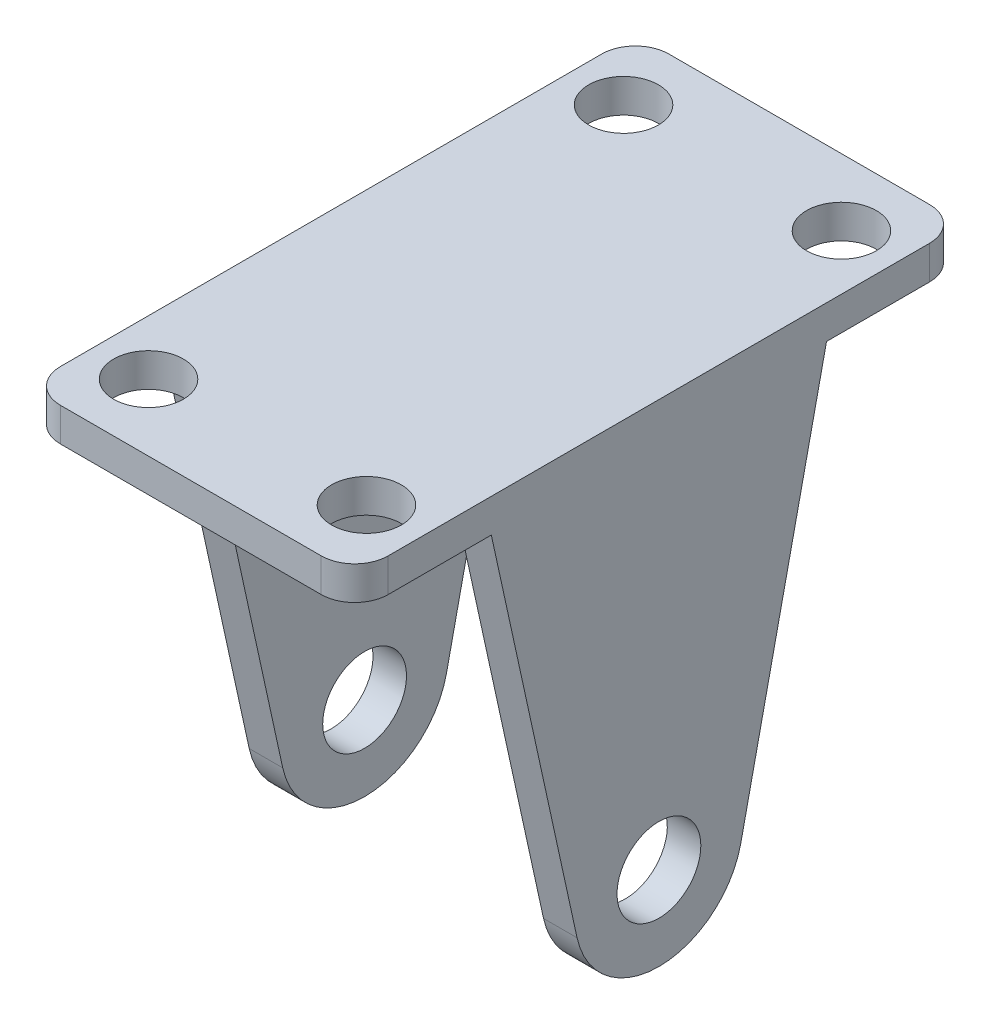
ISO-10303-21;
HEADER;
FILE_DESCRIPTION(('STEP AP214'),'2;1');
FILE_NAME('part.step','',(''),(''),'','','');
FILE_SCHEMA(('AUTOMOTIVE_DESIGN { 1 0 10303 214 1 1 1 1 }'));
ENDSEC;
DATA;
#1=APPLICATION_CONTEXT('core data for automotive mechanical design processes');
#2=APPLICATION_PROTOCOL_DEFINITION('international standard','automotive_design',2000,#1);
#3=PRODUCT_CONTEXT('',#1,'mechanical');
#4=PRODUCT('Part','Part','',(#3));
#5=PRODUCT_RELATED_PRODUCT_CATEGORY('part','',(#4));
#6=PRODUCT_DEFINITION_FORMATION('','',#4);
#7=PRODUCT_DEFINITION_CONTEXT('part definition',#1,'design');
#8=PRODUCT_DEFINITION('design','',#6,#7);
#9=PRODUCT_DEFINITION_SHAPE('','',#8);
#10=(LENGTH_UNIT() NAMED_UNIT(*) SI_UNIT(.MILLI.,.METRE.));
#11=(NAMED_UNIT(*) PLANE_ANGLE_UNIT() SI_UNIT($,.RADIAN.));
#12=(NAMED_UNIT(*) SI_UNIT($,.STERADIAN.) SOLID_ANGLE_UNIT());
#13=UNCERTAINTY_MEASURE_WITH_UNIT(LENGTH_MEASURE(1.E-05),#10,'distance_accuracy_value','');
#14=(GEOMETRIC_REPRESENTATION_CONTEXT(3) GLOBAL_UNCERTAINTY_ASSIGNED_CONTEXT((#13)) GLOBAL_UNIT_ASSIGNED_CONTEXT((#10,
#11,#12)) REPRESENTATION_CONTEXT('',''));
#15=CARTESIAN_POINT('',(0.,0.,0.));
#16=DIRECTION('',(0.,0.,1.));
#17=DIRECTION('',(1.,0.,0.));
#18=AXIS2_PLACEMENT_3D('',#15,#16,#17);
#19=CARTESIAN_POINT('',(55.4001095481556,-32.2188982579742,6.20311311528255));
#20=DIRECTION('',(0.,0.213842245350275,-0.976868207131112));
#21=DIRECTION('',(0.,0.976868207131112,0.213842245350275));
#22=AXIS2_PLACEMENT_3D('',#19,#20,#21);
#23=PLANE('',#22);
#24=DIRECTION('',(-1.,0.,0.));
#25=VECTOR('',#24,1.);
#26=CARTESIAN_POINT('',(55.4001095481556,-32.2188982579742,6.20311311528255));
#27=LINE('',#26,#25);
#28=CARTESIAN_POINT('',(-9.8806,-32.2188982579742,6.20311311528254));
#29=VERTEX_POINT('',#28);
#30=CARTESIAN_POINT('',(-12.4206,-32.2188982579742,6.20311311528255));
#31=VERTEX_POINT('',#30);
#32=EDGE_CURVE('E192',#29,#31,#27,.T.);
#33=ORIENTED_EDGE('',*,*,#32,.F.);
#34=DIRECTION('',(0.,0.976868207131112,0.213842245350275));
#35=VECTOR('',#34,1.);
#36=CARTESIAN_POINT('',(-9.8806,-32.2188982579742,6.20311311528255));
#37=LINE('',#36,#35);
#38=CARTESIAN_POINT('',(-9.8806,-5.08,12.1439789326496));
#39=VERTEX_POINT('',#38);
#40=EDGE_CURVE('E395',#29,#39,#37,.T.);
#41=ORIENTED_EDGE('',*,*,#40,.T.);
#42=CARTESIAN_POINT('',(-7.34059999999999,-5.08,12.1439789326496));
#43=DIRECTION('',(0.,0.213842245350275,-0.976868207131112));
#44=DIRECTION('',(0.,-0.976868207131112,-0.213842245350275));
#45=AXIS2_PLACEMENT_3D('',#42,#43,#44);
#46=ELLIPSE('',#45,2.60014603961729,2.54);
#47=CARTESIAN_POINT('',(-7.34059999999999,-2.54,12.7));
#48=VERTEX_POINT('',#47);
#49=EDGE_CURVE('E353',#39,#48,#46,.T.);
#50=ORIENTED_EDGE('',*,*,#49,.T.);
#51=DIRECTION('',(-1.,0.,0.));
#52=VECTOR('',#51,1.);
#53=CARTESIAN_POINT('',(55.4001095481556,-2.54,12.7));
#54=LINE('',#53,#52);
#55=CARTESIAN_POINT('',(-12.4206,-2.54,12.7));
#56=VERTEX_POINT('',#55);
#57=EDGE_CURVE('E191',#48,#56,#54,.T.);
#58=ORIENTED_EDGE('',*,*,#57,.T.);
#59=DIRECTION('',(0.,-0.976868207131112,-0.213842245350275));
#60=VECTOR('',#59,1.);
#61=CARTESIAN_POINT('',(-12.4206,-32.2188982579742,6.20311311528255));
#62=LINE('',#61,#60);
#63=EDGE_CURVE('E383',#56,#31,#62,.T.);
#64=ORIENTED_EDGE('',*,*,#63,.T.);
#65=EDGE_LOOP('',(#33,#41,#50,#58,#64));
#66=FACE_BOUND('',#65,.T.);
#67=ADVANCED_FACE('F44',(#66),#23,.F.);
#68=CARTESIAN_POINT('',(55.4001095481556,-2.54,-12.7));
#69=DIRECTION('',(0.,0.213842245350274,0.976868207131112));
#70=DIRECTION('',(0.,-0.976868207131112,0.213842245350274));
#71=AXIS2_PLACEMENT_3D('',#68,#69,#70);
#72=PLANE('',#71);
#73=DIRECTION('',(-1.,0.,0.));
#74=VECTOR('',#73,1.);
#75=CARTESIAN_POINT('',(55.4001095481556,-2.54,-12.7));
#76=LINE('',#75,#74);
#77=CARTESIAN_POINT('',(-7.3406,-2.54,-12.7));
#78=VERTEX_POINT('',#77);
#79=CARTESIAN_POINT('',(-12.4206,-2.54,-12.7));
#80=VERTEX_POINT('',#79);
#81=EDGE_CURVE('E202',#78,#80,#76,.T.);
#82=ORIENTED_EDGE('',*,*,#81,.F.);
#83=CARTESIAN_POINT('',(-7.34059999999999,-5.08,-12.1439789326496));
#84=DIRECTION('',(0.,0.213842245350274,0.976868207131112));
#85=DIRECTION('',(0.,0.976868207131112,-0.213842245350274));
#86=AXIS2_PLACEMENT_3D('',#83,#84,#85);
#87=ELLIPSE('',#86,2.60014603961729,2.54);
#88=CARTESIAN_POINT('',(-9.8806,-5.08,-12.1439789326496));
#89=VERTEX_POINT('',#88);
#90=EDGE_CURVE('E357',#78,#89,#87,.T.);
#91=ORIENTED_EDGE('',*,*,#90,.T.);
#92=DIRECTION('',(0.,-0.976868207131112,0.213842245350274));
#93=VECTOR('',#92,1.);
#94=CARTESIAN_POINT('',(-9.8806,-2.54,-12.7));
#95=LINE('',#94,#93);
#96=CARTESIAN_POINT('',(-9.8806,-32.2188982579742,-6.20311311528256));
#97=VERTEX_POINT('',#96);
#98=EDGE_CURVE('E419',#89,#97,#95,.T.);
#99=ORIENTED_EDGE('',*,*,#98,.T.);
#100=DIRECTION('',(-1.,0.,0.));
#101=VECTOR('',#100,1.);
#102=CARTESIAN_POINT('',(55.4001095481556,-32.2188982579742,-6.20311311528256));
#103=LINE('',#102,#101);
#104=CARTESIAN_POINT('',(-12.4206,-32.2188982579742,-6.20311311528256));
#105=VERTEX_POINT('',#104);
#106=EDGE_CURVE('E206',#97,#105,#103,.T.);
#107=ORIENTED_EDGE('',*,*,#106,.T.);
#108=DIRECTION('',(0.,0.976868207131112,-0.213842245350274));
#109=VECTOR('',#108,1.);
#110=CARTESIAN_POINT('',(-12.4206,-2.54,-12.7));
#111=LINE('',#110,#109);
#112=EDGE_CURVE('E376',#105,#80,#111,.T.);
#113=ORIENTED_EDGE('',*,*,#112,.T.);
#114=EDGE_LOOP('',(#82,#91,#99,#107,#113));
#115=FACE_BOUND('',#114,.T.);
#116=ADVANCED_FACE('F377',(#115),#72,.F.);
#117=CARTESIAN_POINT('',(55.4001095481556,-30.861,0.));
#118=DIRECTION('',(-1.,0.,0.));
#119=DIRECTION('',(0.,0.,1.));
#120=AXIS2_PLACEMENT_3D('',#117,#118,#119);
#121=CYLINDRICAL_SURFACE('',#120,6.34999999999999);
#122=CARTESIAN_POINT('',(9.8806,-30.861,0.));
#123=DIRECTION('',(1.,0.,0.));
#124=DIRECTION('',(0.,1.,0.));
#125=AXIS2_PLACEMENT_3D('',#122,#123,#124);
#126=CIRCLE('',#125,6.34999999999999);
#127=CARTESIAN_POINT('',(9.8806,-32.2188982579742,6.20311311528254));
#128=VERTEX_POINT('',#127);
#129=CARTESIAN_POINT('',(9.8806,-32.2188982579742,-6.20311311528256));
#130=VERTEX_POINT('',#129);
#131=EDGE_CURVE('E178',#128,#130,#126,.T.);
#132=ORIENTED_EDGE('',*,*,#131,.T.);
#133=CARTESIAN_POINT('',(12.4206,-32.2188982579742,-6.20311311528256));
#134=VERTEX_POINT('',#133);
#135=EDGE_CURVE('E207',#134,#130,#103,.T.);
#136=ORIENTED_EDGE('',*,*,#135,.F.);
#137=CARTESIAN_POINT('',(12.4206,-30.861,0.));
#138=DIRECTION('',(1.,0.,0.));
#139=DIRECTION('',(0.,0.,-1.));
#140=AXIS2_PLACEMENT_3D('',#137,#138,#139);
#141=CIRCLE('',#140,6.34999999999999);
#142=CARTESIAN_POINT('',(12.4206,-32.2188982579742,6.20311311528255));
#143=VERTEX_POINT('',#142);
#144=EDGE_CURVE('E188',#143,#134,#141,.T.);
#145=ORIENTED_EDGE('',*,*,#144,.F.);
#146=EDGE_CURVE('E172',#143,#128,#27,.T.);
#147=ORIENTED_EDGE('',*,*,#146,.T.);
#148=EDGE_LOOP('',(#132,#136,#145,#147));
#149=FACE_BOUND('',#148,.T.);
#150=ADVANCED_FACE('F186',(#149),#121,.T.);
#151=CARTESIAN_POINT('',(55.4001095481556,-30.861,0.));
#152=DIRECTION('',(-1.,0.,0.));
#153=DIRECTION('',(0.,0.,1.));
#154=AXIS2_PLACEMENT_3D('',#151,#152,#153);
#155=CYLINDRICAL_SURFACE('',#154,3.175);
#156=CARTESIAN_POINT('',(-9.8806,-30.861,0.));
#157=DIRECTION('',(-1.,0.,0.));
#158=DIRECTION('',(0.,-1.,0.));
#159=AXIS2_PLACEMENT_3D('',#156,#157,#158);
#160=CIRCLE('',#159,3.175);
#161=CARTESIAN_POINT('',(-9.8806,-34.036,0.));
#162=VERTEX_POINT('',#161);
#163=EDGE_CURVE('E175',#162,#162,#160,.T.);
#164=ORIENTED_EDGE('',*,*,#163,.F.);
#165=EDGE_LOOP('',(#164));
#166=FACE_BOUND('',#165,.T.);
#167=CARTESIAN_POINT('',(-12.4206,-30.861,0.));
#168=DIRECTION('',(-1.,0.,0.));
#169=DIRECTION('',(0.,0.,1.));
#170=AXIS2_PLACEMENT_3D('',#167,#168,#169);
#171=CIRCLE('',#170,3.175);
#172=CARTESIAN_POINT('',(-12.4206,-30.861,3.17499999999999));
#173=VERTEX_POINT('',#172);
#174=EDGE_CURVE('E216',#173,#173,#171,.F.);
#175=ORIENTED_EDGE('',*,*,#174,.F.);
#176=EDGE_LOOP('',(#175));
#177=FACE_BOUND('',#176,.T.);
#178=ADVANCED_FACE('F524',(#166,#177),#155,.F.);
#179=CARTESIAN_POINT('',(-12.4206,-2.54,23.0505));
#180=DIRECTION('',(-1.,0.,0.));
#181=DIRECTION('',(0.,0.,1.));
#182=AXIS2_PLACEMENT_3D('',#179,#180,#181);
#183=PLANE('',#182);
#184=DIRECTION('',(0.,0.,1.));
#185=VECTOR('',#184,1.);
#186=CARTESIAN_POINT('',(-12.4206,0.,23.0505));
#187=LINE('',#186,#185);
#188=CARTESIAN_POINT('',(-12.4206,0.,-20.5105));
#189=VERTEX_POINT('',#188);
#190=CARTESIAN_POINT('',(-12.4206,0.,20.5105));
#191=VERTEX_POINT('',#190);
#192=EDGE_CURVE('E245',#189,#191,#187,.T.);
#193=ORIENTED_EDGE('',*,*,#192,.F.);
#194=DIRECTION('',(0.,1.,0.));
#195=VECTOR('',#194,1.);
#196=CARTESIAN_POINT('',(-12.4206,-2.54,-20.5105));
#197=LINE('',#196,#195);
#198=CARTESIAN_POINT('',(-12.4206,-2.54,-20.5105));
#199=VERTEX_POINT('',#198);
#200=EDGE_CURVE('E310',#189,#199,#197,.F.);
#201=ORIENTED_EDGE('',*,*,#200,.T.);
#202=DIRECTION('',(0.,0.,1.));
#203=VECTOR('',#202,1.);
#204=CARTESIAN_POINT('',(-12.4206,-2.54,23.0505));
#205=LINE('',#204,#203);
#206=EDGE_CURVE('E249',#199,#80,#205,.T.);
#207=ORIENTED_EDGE('',*,*,#206,.T.);
#208=ORIENTED_EDGE('',*,*,#112,.F.);
#209=CARTESIAN_POINT('',(-12.4206,-30.861,0.));
#210=DIRECTION('',(-1.,0.,0.));
#211=DIRECTION('',(0.,0.,1.));
#212=AXIS2_PLACEMENT_3D('',#209,#210,#211);
#213=CIRCLE('',#212,6.34999999999999);
#214=EDGE_CURVE('E390',#31,#105,#213,.F.);
#215=ORIENTED_EDGE('',*,*,#214,.F.);
#216=ORIENTED_EDGE('',*,*,#63,.F.);
#217=CARTESIAN_POINT('',(-12.4206,-2.54,20.5105));
#218=VERTEX_POINT('',#217);
#219=EDGE_CURVE('E253',#56,#218,#205,.T.);
#220=ORIENTED_EDGE('',*,*,#219,.T.);
#221=DIRECTION('',(0.,1.,0.));
#222=VECTOR('',#221,1.);
#223=CARTESIAN_POINT('',(-12.4206,-2.54,20.5105));
#224=LINE('',#223,#222);
#225=EDGE_CURVE('E306',#218,#191,#224,.T.);
#226=ORIENTED_EDGE('',*,*,#225,.T.);
#227=EDGE_LOOP('',(#193,#201,#207,#208,#215,#216,#220,#226));
#228=FACE_BOUND('',#227,.T.);
#229=ORIENTED_EDGE('',*,*,#174,.T.);
#230=EDGE_LOOP('',(#229));
#231=FACE_BOUND('',#230,.T.);
#232=ADVANCED_FACE('F434',(#228,#231),#183,.T.);
#233=CARTESIAN_POINT('',(12.4206,-2.54,-23.0505));
#234=DIRECTION('',(0.,0.,-1.));
#235=DIRECTION('',(-1.,0.,0.));
#236=AXIS2_PLACEMENT_3D('',#233,#234,#235);
#237=PLANE('',#236);
#238=DIRECTION('',(-1.,0.,0.));
#239=VECTOR('',#238,1.);
#240=CARTESIAN_POINT('',(12.4206,-2.54,-23.0505));
#241=LINE('',#240,#239);
#242=CARTESIAN_POINT('',(9.8806,-2.54,-23.0505));
#243=VERTEX_POINT('',#242);
#244=CARTESIAN_POINT('',(-9.8806,-2.54,-23.0505));
#245=VERTEX_POINT('',#244);
#246=EDGE_CURVE('E261',#243,#245,#241,.T.);
#247=ORIENTED_EDGE('',*,*,#246,.T.);
#248=DIRECTION('',(0.,1.,0.));
#249=VECTOR('',#248,1.);
#250=CARTESIAN_POINT('',(-9.8806,-2.54,-23.0505));
#251=LINE('',#250,#249);
#252=CARTESIAN_POINT('',(-9.8806,0.,-23.0505));
#253=VERTEX_POINT('',#252);
#254=EDGE_CURVE('E290',#245,#253,#251,.T.);
#255=ORIENTED_EDGE('',*,*,#254,.T.);
#256=DIRECTION('',(-1.,0.,0.));
#257=VECTOR('',#256,1.);
#258=CARTESIAN_POINT('',(12.4206,0.,-23.0505));
#259=LINE('',#258,#257);
#260=CARTESIAN_POINT('',(9.8806,0.,-23.0505));
#261=VERTEX_POINT('',#260);
#262=EDGE_CURVE('E277',#261,#253,#259,.T.);
#263=ORIENTED_EDGE('',*,*,#262,.F.);
#264=DIRECTION('',(0.,1.,0.));
#265=VECTOR('',#264,1.);
#266=CARTESIAN_POINT('',(9.8806,-2.54,-23.0505));
#267=LINE('',#266,#265);
#268=EDGE_CURVE('E265',#261,#243,#267,.F.);
#269=ORIENTED_EDGE('',*,*,#268,.T.);
#270=EDGE_LOOP('',(#247,#255,#263,#269));
#271=FACE_BOUND('',#270,.T.);
#272=ADVANCED_FACE('F461',(#271),#237,.T.);
#273=CARTESIAN_POINT('',(12.4206,-2.54,23.0505));
#274=DIRECTION('',(1.,0.,0.));
#275=DIRECTION('',(0.,0.,-1.));
#276=AXIS2_PLACEMENT_3D('',#273,#274,#275);
#277=PLANE('',#276);
#278=DIRECTION('',(0.,0.,-1.));
#279=VECTOR('',#278,1.);
#280=CARTESIAN_POINT('',(12.4206,-2.54,23.0505));
#281=LINE('',#280,#279);
#282=CARTESIAN_POINT('',(12.4206,-2.54,-12.7));
#283=VERTEX_POINT('',#282);
#284=CARTESIAN_POINT('',(12.4206,-2.54,-20.5105));
#285=VERTEX_POINT('',#284);
#286=EDGE_CURVE('E257',#283,#285,#281,.T.);
#287=ORIENTED_EDGE('',*,*,#286,.T.);
#288=DIRECTION('',(0.,1.,0.));
#289=VECTOR('',#288,1.);
#290=CARTESIAN_POINT('',(12.4206,-2.54,-20.5105));
#291=LINE('',#290,#289);
#292=CARTESIAN_POINT('',(12.4206,0.,-20.5105));
#293=VERTEX_POINT('',#292);
#294=EDGE_CURVE('E336',#285,#293,#291,.T.);
#295=ORIENTED_EDGE('',*,*,#294,.T.);
#296=DIRECTION('',(0.,0.,-1.));
#297=VECTOR('',#296,1.);
#298=CARTESIAN_POINT('',(12.4206,0.,23.0505));
#299=LINE('',#298,#297);
#300=CARTESIAN_POINT('',(12.4206,0.,20.5105));
#301=VERTEX_POINT('',#300);
#302=EDGE_CURVE('E273',#301,#293,#299,.T.);
#303=ORIENTED_EDGE('',*,*,#302,.F.);
#304=DIRECTION('',(0.,1.,0.));
#305=VECTOR('',#304,1.);
#306=CARTESIAN_POINT('',(12.4206,-2.54,20.5105));
#307=LINE('',#306,#305);
#308=CARTESIAN_POINT('',(12.4206,-2.54,20.5105));
#309=VERTEX_POINT('',#308);
#310=EDGE_CURVE('E333',#301,#309,#307,.F.);
#311=ORIENTED_EDGE('',*,*,#310,.T.);
#312=CARTESIAN_POINT('',(12.4206,-2.54,12.7));
#313=VERTEX_POINT('',#312);
#314=EDGE_CURVE('E258',#309,#313,#281,.T.);
#315=ORIENTED_EDGE('',*,*,#314,.T.);
#316=DIRECTION('',(0.,-0.976868207131112,-0.213842245350275));
#317=VECTOR('',#316,1.);
#318=CARTESIAN_POINT('',(12.4206,-32.2188982579742,6.20311311528255));
#319=LINE('',#318,#317);
#320=EDGE_CURVE('E215',#313,#143,#319,.T.);
#321=ORIENTED_EDGE('',*,*,#320,.T.);
#322=ORIENTED_EDGE('',*,*,#144,.T.);
#323=DIRECTION('',(0.,0.976868207131112,-0.213842245350274));
#324=VECTOR('',#323,1.);
#325=CARTESIAN_POINT('',(12.4206,-2.54,-12.7));
#326=LINE('',#325,#324);
#327=EDGE_CURVE('E398',#134,#283,#326,.T.);
#328=ORIENTED_EDGE('',*,*,#327,.T.);
#329=EDGE_LOOP('',(#287,#295,#303,#311,#315,#321,#322,#328));
#330=FACE_BOUND('',#329,.T.);
#331=CARTESIAN_POINT('',(12.4206,-30.861,0.));
#332=DIRECTION('',(1.,0.,0.));
#333=DIRECTION('',(0.,0.,-1.));
#334=AXIS2_PLACEMENT_3D('',#331,#332,#333);
#335=CIRCLE('',#334,3.175);
#336=CARTESIAN_POINT('',(12.4206,-30.861,-3.17500000000001));
#337=VERTEX_POINT('',#336);
#338=EDGE_CURVE('E211',#337,#337,#335,.T.);
#339=ORIENTED_EDGE('',*,*,#338,.F.);
#340=EDGE_LOOP('',(#339));
#341=FACE_BOUND('',#340,.T.);
#342=ADVANCED_FACE('F403',(#330,#341),#277,.T.);
#343=CARTESIAN_POINT('',(12.4206,-2.54,23.0505));
#344=DIRECTION('',(0.,0.,1.));
#345=DIRECTION('',(1.,0.,0.));
#346=AXIS2_PLACEMENT_3D('',#343,#344,#345);
#347=PLANE('',#346);
#348=DIRECTION('',(1.,0.,0.));
#349=VECTOR('',#348,1.);
#350=CARTESIAN_POINT('',(12.4206,0.,23.0505));
#351=LINE('',#350,#349);
#352=CARTESIAN_POINT('',(-9.8806,0.,23.0505));
#353=VERTEX_POINT('',#352);
#354=CARTESIAN_POINT('',(9.8806,0.,23.0505));
#355=VERTEX_POINT('',#354);
#356=EDGE_CURVE('E269',#353,#355,#351,.T.);
#357=ORIENTED_EDGE('',*,*,#356,.F.);
#358=DIRECTION('',(0.,1.,0.));
#359=VECTOR('',#358,1.);
#360=CARTESIAN_POINT('',(-9.8806,-2.54,23.0505));
#361=LINE('',#360,#359);
#362=CARTESIAN_POINT('',(-9.8806,-2.54,23.0505));
#363=VERTEX_POINT('',#362);
#364=EDGE_CURVE('E344',#353,#363,#361,.F.);
#365=ORIENTED_EDGE('',*,*,#364,.T.);
#366=DIRECTION('',(1.,0.,0.));
#367=VECTOR('',#366,1.);
#368=CARTESIAN_POINT('',(12.4206,-2.54,23.0505));
#369=LINE('',#368,#367);
#370=CARTESIAN_POINT('',(9.8806,-2.54,23.0505));
#371=VERTEX_POINT('',#370);
#372=EDGE_CURVE('E252',#363,#371,#369,.T.);
#373=ORIENTED_EDGE('',*,*,#372,.T.);
#374=DIRECTION('',(0.,1.,0.));
#375=VECTOR('',#374,1.);
#376=CARTESIAN_POINT('',(9.8806,-2.54,23.0505));
#377=LINE('',#376,#375);
#378=EDGE_CURVE('E340',#371,#355,#377,.T.);
#379=ORIENTED_EDGE('',*,*,#378,.T.);
#380=EDGE_LOOP('',(#357,#365,#373,#379));
#381=FACE_BOUND('',#380,.T.);
#382=ADVANCED_FACE('F447',(#381),#347,.T.);
#383=CARTESIAN_POINT('',(0.,-2.54,0.));
#384=DIRECTION('',(0.,1.,0.));
#385=DIRECTION('',(0.,0.,1.));
#386=AXIS2_PLACEMENT_3D('',#383,#384,#385);
#387=PLANE('',#386);
#388=CARTESIAN_POINT('',(-8.25499999999999,-2.54,17.9959));
#389=DIRECTION('',(0.,1.,0.));
#390=DIRECTION('',(0.,0.,1.));
#391=AXIS2_PLACEMENT_3D('',#388,#389,#390);
#392=CIRCLE('',#391,2.6416);
#393=CARTESIAN_POINT('',(-8.25499999999999,-2.54,20.6375));
#394=VERTEX_POINT('',#393);
#395=EDGE_CURVE('E217',#394,#394,#392,.T.);
#396=ORIENTED_EDGE('',*,*,#395,.T.);
#397=EDGE_LOOP('',(#396));
#398=FACE_BOUND('',#397,.T.);
#399=CARTESIAN_POINT('',(8.25500000000001,-2.54,17.9959));
#400=DIRECTION('',(0.,1.,0.));
#401=DIRECTION('',(0.,0.,1.));
#402=AXIS2_PLACEMENT_3D('',#399,#400,#401);
#403=CIRCLE('',#402,2.6416);
#404=CARTESIAN_POINT('',(8.25500000000001,-2.54,20.6375));
#405=VERTEX_POINT('',#404);
#406=EDGE_CURVE('E225',#405,#405,#403,.T.);
#407=ORIENTED_EDGE('',*,*,#406,.T.);
#408=EDGE_LOOP('',(#407));
#409=FACE_BOUND('',#408,.T.);
#410=CARTESIAN_POINT('',(-8.255,-2.54,-17.9959));
#411=DIRECTION('',(0.,1.,0.));
#412=DIRECTION('',(0.,0.,1.));
#413=AXIS2_PLACEMENT_3D('',#410,#411,#412);
#414=CIRCLE('',#413,2.6416);
#415=CARTESIAN_POINT('',(-8.255,-2.54,-15.3543));
#416=VERTEX_POINT('',#415);
#417=EDGE_CURVE('E241',#416,#416,#414,.T.);
#418=ORIENTED_EDGE('',*,*,#417,.T.);
#419=EDGE_LOOP('',(#418));
#420=FACE_BOUND('',#419,.T.);
#421=CARTESIAN_POINT('',(8.25500000000001,-2.54,-17.9959));
#422=DIRECTION('',(0.,1.,0.));
#423=DIRECTION('',(0.,0.,1.));
#424=AXIS2_PLACEMENT_3D('',#421,#422,#423);
#425=CIRCLE('',#424,2.6416);
#426=CARTESIAN_POINT('',(8.25500000000001,-2.54,-15.3543));
#427=VERTEX_POINT('',#426);
#428=EDGE_CURVE('E233',#427,#427,#425,.T.);
#429=ORIENTED_EDGE('',*,*,#428,.T.);
#430=EDGE_LOOP('',(#429));
#431=FACE_BOUND('',#430,.T.);
#432=ORIENTED_EDGE('',*,*,#206,.F.);
#433=CARTESIAN_POINT('',(-9.8806,-2.54,-20.5105));
#434=DIRECTION('',(0.,1.,0.));
#435=DIRECTION('',(0.,0.,1.));
#436=AXIS2_PLACEMENT_3D('',#433,#434,#435);
#437=CIRCLE('',#436,2.54);
#438=EDGE_CURVE('E330',#199,#245,#437,.F.);
#439=ORIENTED_EDGE('',*,*,#438,.T.);
#440=ORIENTED_EDGE('',*,*,#246,.F.);
#441=CARTESIAN_POINT('',(9.8806,-2.54,-20.5105));
#442=DIRECTION('',(0.,1.,0.));
#443=DIRECTION('',(0.,0.,1.));
#444=AXIS2_PLACEMENT_3D('',#441,#442,#443);
#445=CIRCLE('',#444,2.54);
#446=EDGE_CURVE('E327',#243,#285,#445,.F.);
#447=ORIENTED_EDGE('',*,*,#446,.T.);
#448=ORIENTED_EDGE('',*,*,#286,.F.);
#449=CARTESIAN_POINT('',(7.3406,-2.54,-12.7));
#450=VERTEX_POINT('',#449);
#451=EDGE_CURVE('E203',#283,#450,#76,.T.);
#452=ORIENTED_EDGE('',*,*,#451,.T.);
#453=DIRECTION('',(0.,0.,1.));
#454=VECTOR('',#453,1.);
#455=CARTESIAN_POINT('',(7.3406,-2.54,12.7));
#456=LINE('',#455,#454);
#457=CARTESIAN_POINT('',(7.3406,-2.54,12.7));
#458=VERTEX_POINT('',#457);
#459=EDGE_CURVE('E313',#450,#458,#456,.T.);
#460=ORIENTED_EDGE('',*,*,#459,.T.);
#461=EDGE_CURVE('E196',#313,#458,#54,.T.);
#462=ORIENTED_EDGE('',*,*,#461,.F.);
#463=ORIENTED_EDGE('',*,*,#314,.F.);
#464=CARTESIAN_POINT('',(9.8806,-2.54,20.5105));
#465=DIRECTION('',(0.,1.,0.));
#466=DIRECTION('',(0.,0.,1.));
#467=AXIS2_PLACEMENT_3D('',#464,#465,#466);
#468=CIRCLE('',#467,2.54);
#469=EDGE_CURVE('E321',#309,#371,#468,.F.);
#470=ORIENTED_EDGE('',*,*,#469,.T.);
#471=ORIENTED_EDGE('',*,*,#372,.F.);
#472=CARTESIAN_POINT('',(-9.8806,-2.54,20.5105));
#473=DIRECTION('',(0.,1.,0.));
#474=DIRECTION('',(0.,0.,1.));
#475=AXIS2_PLACEMENT_3D('',#472,#473,#474);
#476=CIRCLE('',#475,2.54);
#477=EDGE_CURVE('E324',#363,#218,#476,.F.);
#478=ORIENTED_EDGE('',*,*,#477,.T.);
#479=ORIENTED_EDGE('',*,*,#219,.F.);
#480=ORIENTED_EDGE('',*,*,#57,.F.);
#481=DIRECTION('',(0.,0.,1.));
#482=VECTOR('',#481,1.);
#483=CARTESIAN_POINT('',(-7.34059999999999,-2.54,-12.7));
#484=LINE('',#483,#482);
#485=EDGE_CURVE('E317',#48,#78,#484,.F.);
#486=ORIENTED_EDGE('',*,*,#485,.T.);
#487=ORIENTED_EDGE('',*,*,#81,.T.);
#488=EDGE_LOOP('',(#432,#439,#440,#447,#448,#452,#460,#462,#463,#470,#471,#478,#479,#480,#486,#487));
#489=FACE_BOUND('',#488,.T.);
#490=ADVANCED_FACE('F370',(#398,#409,#420,#431,#489),#387,.F.);
#491=CARTESIAN_POINT('',(0.,0.,0.));
#492=DIRECTION('',(0.,1.,0.));
#493=DIRECTION('',(0.,0.,1.));
#494=AXIS2_PLACEMENT_3D('',#491,#492,#493);
#495=PLANE('',#494);
#496=CARTESIAN_POINT('',(-8.25499999999999,0.,17.9959));
#497=DIRECTION('',(0.,1.,0.));
#498=DIRECTION('',(0.,0.,1.));
#499=AXIS2_PLACEMENT_3D('',#496,#497,#498);
#500=CIRCLE('',#499,2.6416);
#501=CARTESIAN_POINT('',(-8.25499999999999,0.,20.6375));
#502=VERTEX_POINT('',#501);
#503=EDGE_CURVE('E210',#502,#502,#500,.T.);
#504=ORIENTED_EDGE('',*,*,#503,.F.);
#505=EDGE_LOOP('',(#504));
#506=FACE_BOUND('',#505,.T.);
#507=CARTESIAN_POINT('',(8.25500000000001,0.,17.9959));
#508=DIRECTION('',(0.,1.,0.));
#509=DIRECTION('',(0.,0.,1.));
#510=AXIS2_PLACEMENT_3D('',#507,#508,#509);
#511=CIRCLE('',#510,2.6416);
#512=CARTESIAN_POINT('',(8.25500000000001,0.,20.6375));
#513=VERTEX_POINT('',#512);
#514=EDGE_CURVE('E221',#513,#513,#511,.T.);
#515=ORIENTED_EDGE('',*,*,#514,.F.);
#516=EDGE_LOOP('',(#515));
#517=FACE_BOUND('',#516,.T.);
#518=CARTESIAN_POINT('',(8.25500000000001,0.,-17.9959));
#519=DIRECTION('',(0.,1.,0.));
#520=DIRECTION('',(0.,0.,1.));
#521=AXIS2_PLACEMENT_3D('',#518,#519,#520);
#522=CIRCLE('',#521,2.6416);
#523=CARTESIAN_POINT('',(8.25500000000001,0.,-15.3543));
#524=VERTEX_POINT('',#523);
#525=EDGE_CURVE('E229',#524,#524,#522,.T.);
#526=ORIENTED_EDGE('',*,*,#525,.F.);
#527=EDGE_LOOP('',(#526));
#528=FACE_BOUND('',#527,.T.);
#529=CARTESIAN_POINT('',(-8.255,0.,-17.9959));
#530=DIRECTION('',(0.,1.,0.));
#531=DIRECTION('',(0.,0.,1.));
#532=AXIS2_PLACEMENT_3D('',#529,#530,#531);
#533=CIRCLE('',#532,2.6416);
#534=CARTESIAN_POINT('',(-8.255,0.,-15.3543));
#535=VERTEX_POINT('',#534);
#536=EDGE_CURVE('E237',#535,#535,#533,.T.);
#537=ORIENTED_EDGE('',*,*,#536,.F.);
#538=EDGE_LOOP('',(#537));
#539=FACE_BOUND('',#538,.T.);
#540=ORIENTED_EDGE('',*,*,#262,.T.);
#541=CARTESIAN_POINT('',(-9.8806,0.,-20.5105));
#542=DIRECTION('',(0.,1.,0.));
#543=DIRECTION('',(0.,0.,1.));
#544=AXIS2_PLACEMENT_3D('',#541,#542,#543);
#545=CIRCLE('',#544,2.54);
#546=EDGE_CURVE('E303',#253,#189,#545,.T.);
#547=ORIENTED_EDGE('',*,*,#546,.T.);
#548=ORIENTED_EDGE('',*,*,#192,.T.);
#549=CARTESIAN_POINT('',(-9.8806,0.,20.5105));
#550=DIRECTION('',(0.,1.,0.));
#551=DIRECTION('',(0.,0.,1.));
#552=AXIS2_PLACEMENT_3D('',#549,#550,#551);
#553=CIRCLE('',#552,2.54);
#554=EDGE_CURVE('E297',#191,#353,#553,.T.);
#555=ORIENTED_EDGE('',*,*,#554,.T.);
#556=ORIENTED_EDGE('',*,*,#356,.T.);
#557=CARTESIAN_POINT('',(9.8806,0.,20.5105));
#558=DIRECTION('',(0.,1.,0.));
#559=DIRECTION('',(0.,0.,1.));
#560=AXIS2_PLACEMENT_3D('',#557,#558,#559);
#561=CIRCLE('',#560,2.54);
#562=EDGE_CURVE('E294',#355,#301,#561,.T.);
#563=ORIENTED_EDGE('',*,*,#562,.T.);
#564=ORIENTED_EDGE('',*,*,#302,.T.);
#565=CARTESIAN_POINT('',(9.8806,0.,-20.5105));
#566=DIRECTION('',(0.,1.,0.));
#567=DIRECTION('',(0.,0.,1.));
#568=AXIS2_PLACEMENT_3D('',#565,#566,#567);
#569=CIRCLE('',#568,2.54);
#570=EDGE_CURVE('E300',#293,#261,#569,.T.);
#571=ORIENTED_EDGE('',*,*,#570,.T.);
#572=EDGE_LOOP('',(#540,#547,#548,#555,#556,#563,#564,#571));
#573=FACE_BOUND('',#572,.T.);
#574=ADVANCED_FACE('F445',(#506,#517,#528,#539,#573),#495,.T.);
#575=CARTESIAN_POINT('',(-8.255,-2.54,-17.9959));
#576=DIRECTION('',(0.,1.,0.));
#577=DIRECTION('',(0.,0.,1.));
#578=AXIS2_PLACEMENT_3D('',#575,#576,#577);
#579=CYLINDRICAL_SURFACE('',#578,2.6416);
#580=ORIENTED_EDGE('',*,*,#417,.F.);
#581=EDGE_LOOP('',(#580));
#582=FACE_BOUND('',#581,.T.);
#583=ORIENTED_EDGE('',*,*,#536,.T.);
#584=EDGE_LOOP('',(#583));
#585=FACE_BOUND('',#584,.T.);
#586=ADVANCED_FACE('F508',(#582,#585),#579,.F.);
#587=CARTESIAN_POINT('',(8.25500000000001,-2.54,-17.9959));
#588=DIRECTION('',(0.,1.,0.));
#589=DIRECTION('',(0.,0.,1.));
#590=AXIS2_PLACEMENT_3D('',#587,#588,#589);
#591=CYLINDRICAL_SURFACE('',#590,2.6416);
#592=ORIENTED_EDGE('',*,*,#428,.F.);
#593=EDGE_LOOP('',(#592));
#594=FACE_BOUND('',#593,.T.);
#595=ORIENTED_EDGE('',*,*,#525,.T.);
#596=EDGE_LOOP('',(#595));
#597=FACE_BOUND('',#596,.T.);
#598=ADVANCED_FACE('F499',(#594,#597),#591,.F.);
#599=CARTESIAN_POINT('',(8.25500000000001,-2.54,17.9959));
#600=DIRECTION('',(0.,1.,0.));
#601=DIRECTION('',(0.,0.,1.));
#602=AXIS2_PLACEMENT_3D('',#599,#600,#601);
#603=CYLINDRICAL_SURFACE('',#602,2.6416);
#604=ORIENTED_EDGE('',*,*,#406,.F.);
#605=EDGE_LOOP('',(#604));
#606=FACE_BOUND('',#605,.T.);
#607=ORIENTED_EDGE('',*,*,#514,.T.);
#608=EDGE_LOOP('',(#607));
#609=FACE_BOUND('',#608,.T.);
#610=ADVANCED_FACE('F492',(#606,#609),#603,.F.);
#611=CARTESIAN_POINT('',(-8.25499999999999,-2.54,17.9959));
#612=DIRECTION('',(0.,1.,0.));
#613=DIRECTION('',(0.,0.,1.));
#614=AXIS2_PLACEMENT_3D('',#611,#612,#613);
#615=CYLINDRICAL_SURFACE('',#614,2.6416);
#616=ORIENTED_EDGE('',*,*,#395,.F.);
#617=EDGE_LOOP('',(#616));
#618=FACE_BOUND('',#617,.T.);
#619=ORIENTED_EDGE('',*,*,#503,.T.);
#620=EDGE_LOOP('',(#619));
#621=FACE_BOUND('',#620,.T.);
#622=ADVANCED_FACE('F486',(#618,#621),#615,.F.);
#623=ORIENTED_EDGE('',*,*,#461,.T.);
#624=CARTESIAN_POINT('',(7.3406,-5.08,12.1439789326496));
#625=DIRECTION('',(0.,0.213842245350275,-0.976868207131112));
#626=DIRECTION('',(0.,-0.976868207131112,-0.213842245350275));
#627=AXIS2_PLACEMENT_3D('',#624,#625,#626);
#628=ELLIPSE('',#627,2.60014603961729,2.54);
#629=CARTESIAN_POINT('',(9.88059999999999,-5.08,12.1439789326496));
#630=VERTEX_POINT('',#629);
#631=EDGE_CURVE('E53',#458,#630,#628,.T.);
#632=ORIENTED_EDGE('',*,*,#631,.T.);
#633=DIRECTION('',(0.,-0.976868207131112,-0.213842245350275));
#634=VECTOR('',#633,1.);
#635=CARTESIAN_POINT('',(9.8806,-32.2188982579742,6.20311311528255));
#636=LINE('',#635,#634);
#637=EDGE_CURVE('E167',#630,#128,#636,.T.);
#638=ORIENTED_EDGE('',*,*,#637,.T.);
#639=ORIENTED_EDGE('',*,*,#146,.F.);
#640=ORIENTED_EDGE('',*,*,#320,.F.);
#641=EDGE_LOOP('',(#623,#632,#638,#639,#640));
#642=FACE_BOUND('',#641,.T.);
#643=ADVANCED_FACE('F169',(#642),#23,.F.);
#644=ORIENTED_EDGE('',*,*,#135,.T.);
#645=DIRECTION('',(0.,0.976868207131112,-0.213842245350274));
#646=VECTOR('',#645,1.);
#647=CARTESIAN_POINT('',(9.8806,-2.54,-12.7));
#648=LINE('',#647,#646);
#649=CARTESIAN_POINT('',(9.8806,-5.08,-12.1439789326496));
#650=VERTEX_POINT('',#649);
#651=EDGE_CURVE('E176',#130,#650,#648,.T.);
#652=ORIENTED_EDGE('',*,*,#651,.T.);
#653=CARTESIAN_POINT('',(7.3406,-5.08,-12.1439789326496));
#654=DIRECTION('',(0.,0.213842245350274,0.976868207131112));
#655=DIRECTION('',(0.,0.976868207131112,-0.213842245350274));
#656=AXIS2_PLACEMENT_3D('',#653,#654,#655);
#657=ELLIPSE('',#656,2.60014603961729,2.54);
#658=EDGE_CURVE('E11',#650,#450,#657,.T.);
#659=ORIENTED_EDGE('',*,*,#658,.T.);
#660=ORIENTED_EDGE('',*,*,#451,.F.);
#661=ORIENTED_EDGE('',*,*,#327,.F.);
#662=EDGE_LOOP('',(#644,#652,#659,#660,#661));
#663=FACE_BOUND('',#662,.T.);
#664=ADVANCED_FACE('F412',(#663),#72,.F.);
#665=ORIENTED_EDGE('',*,*,#106,.F.);
#666=CARTESIAN_POINT('',(-9.8806,-30.861,0.));
#667=DIRECTION('',(-1.,0.,0.));
#668=DIRECTION('',(0.,-1.,0.));
#669=AXIS2_PLACEMENT_3D('',#666,#667,#668);
#670=CIRCLE('',#669,6.34999999999999);
#671=EDGE_CURVE('E287',#97,#29,#670,.T.);
#672=ORIENTED_EDGE('',*,*,#671,.T.);
#673=ORIENTED_EDGE('',*,*,#32,.T.);
#674=ORIENTED_EDGE('',*,*,#214,.T.);
#675=EDGE_LOOP('',(#665,#672,#673,#674));
#676=FACE_BOUND('',#675,.T.);
#677=ADVANCED_FACE('F431',(#676),#121,.T.);
#678=CARTESIAN_POINT('',(9.8806,-30.861,0.));
#679=DIRECTION('',(1.,0.,0.));
#680=DIRECTION('',(0.,1.,0.));
#681=AXIS2_PLACEMENT_3D('',#678,#679,#680);
#682=CIRCLE('',#681,3.175);
#683=CARTESIAN_POINT('',(9.8806,-27.686,0.));
#684=VERTEX_POINT('',#683);
#685=EDGE_CURVE('E184',#684,#684,#682,.T.);
#686=ORIENTED_EDGE('',*,*,#685,.F.);
#687=EDGE_LOOP('',(#686));
#688=FACE_BOUND('',#687,.T.);
#689=ORIENTED_EDGE('',*,*,#338,.T.);
#690=EDGE_LOOP('',(#689));
#691=FACE_BOUND('',#690,.T.);
#692=ADVANCED_FACE('F529',(#688,#691),#155,.F.);
#693=CARTESIAN_POINT('',(-9.88059999999999,-2.54,-23.0505));
#694=DIRECTION('',(-1.,0.,0.));
#695=DIRECTION('',(0.,-1.,0.));
#696=AXIS2_PLACEMENT_3D('',#693,#694,#695);
#697=PLANE('',#696);
#698=ORIENTED_EDGE('',*,*,#163,.T.);
#699=EDGE_LOOP('',(#698));
#700=FACE_BOUND('',#699,.T.);
#701=ORIENTED_EDGE('',*,*,#98,.F.);
#702=DIRECTION('',(0.,0.,1.));
#703=VECTOR('',#702,1.);
#704=CARTESIAN_POINT('',(-9.88059999999999,-5.08,12.7));
#705=LINE('',#704,#703);
#706=EDGE_CURVE('E347',#89,#39,#705,.T.);
#707=ORIENTED_EDGE('',*,*,#706,.T.);
#708=ORIENTED_EDGE('',*,*,#40,.F.);
#709=ORIENTED_EDGE('',*,*,#671,.F.);
#710=EDGE_LOOP('',(#701,#707,#708,#709));
#711=FACE_BOUND('',#710,.T.);
#712=ADVANCED_FACE('F428',(#700,#711),#697,.F.);
#713=CARTESIAN_POINT('',(9.8806,-2.54,-23.0505));
#714=DIRECTION('',(1.,0.,0.));
#715=DIRECTION('',(0.,1.,0.));
#716=AXIS2_PLACEMENT_3D('',#713,#714,#715);
#717=PLANE('',#716);
#718=ORIENTED_EDGE('',*,*,#685,.T.);
#719=EDGE_LOOP('',(#718));
#720=FACE_BOUND('',#719,.T.);
#721=ORIENTED_EDGE('',*,*,#637,.F.);
#722=DIRECTION('',(0.,0.,1.));
#723=VECTOR('',#722,1.);
#724=CARTESIAN_POINT('',(9.8806,-5.08,-12.7));
#725=LINE('',#724,#723);
#726=EDGE_CURVE('E66',#630,#650,#725,.F.);
#727=ORIENTED_EDGE('',*,*,#726,.T.);
#728=ORIENTED_EDGE('',*,*,#651,.F.);
#729=ORIENTED_EDGE('',*,*,#131,.F.);
#730=EDGE_LOOP('',(#721,#727,#728,#729));
#731=FACE_BOUND('',#730,.T.);
#732=ADVANCED_FACE('F179',(#720,#731),#717,.F.);
#733=CARTESIAN_POINT('',(-9.8806,-2.54,-20.5105));
#734=DIRECTION('',(0.,1.,0.));
#735=DIRECTION('',(0.,0.,1.));
#736=AXIS2_PLACEMENT_3D('',#733,#734,#735);
#737=CYLINDRICAL_SURFACE('',#736,2.54);
#738=ORIENTED_EDGE('',*,*,#438,.F.);
#739=ORIENTED_EDGE('',*,*,#200,.F.);
#740=ORIENTED_EDGE('',*,*,#546,.F.);
#741=ORIENTED_EDGE('',*,*,#254,.F.);
#742=EDGE_LOOP('',(#738,#739,#740,#741));
#743=FACE_BOUND('',#742,.T.);
#744=ADVANCED_FACE('F465',(#743),#737,.T.);
#745=CARTESIAN_POINT('',(9.8806,-2.54,-20.5105));
#746=DIRECTION('',(0.,1.,0.));
#747=DIRECTION('',(0.,0.,1.));
#748=AXIS2_PLACEMENT_3D('',#745,#746,#747);
#749=CYLINDRICAL_SURFACE('',#748,2.54);
#750=ORIENTED_EDGE('',*,*,#446,.F.);
#751=ORIENTED_EDGE('',*,*,#268,.F.);
#752=ORIENTED_EDGE('',*,*,#570,.F.);
#753=ORIENTED_EDGE('',*,*,#294,.F.);
#754=EDGE_LOOP('',(#750,#751,#752,#753));
#755=FACE_BOUND('',#754,.T.);
#756=ADVANCED_FACE('F457',(#755),#749,.T.);
#757=CARTESIAN_POINT('',(-9.8806,-2.54,20.5105));
#758=DIRECTION('',(0.,1.,0.));
#759=DIRECTION('',(0.,0.,1.));
#760=AXIS2_PLACEMENT_3D('',#757,#758,#759);
#761=CYLINDRICAL_SURFACE('',#760,2.54);
#762=ORIENTED_EDGE('',*,*,#477,.F.);
#763=ORIENTED_EDGE('',*,*,#364,.F.);
#764=ORIENTED_EDGE('',*,*,#554,.F.);
#765=ORIENTED_EDGE('',*,*,#225,.F.);
#766=EDGE_LOOP('',(#762,#763,#764,#765));
#767=FACE_BOUND('',#766,.T.);
#768=ADVANCED_FACE('F441',(#767),#761,.T.);
#769=CARTESIAN_POINT('',(9.8806,-2.54,20.5105));
#770=DIRECTION('',(0.,1.,0.));
#771=DIRECTION('',(0.,0.,1.));
#772=AXIS2_PLACEMENT_3D('',#769,#770,#771);
#773=CYLINDRICAL_SURFACE('',#772,2.54);
#774=ORIENTED_EDGE('',*,*,#469,.F.);
#775=ORIENTED_EDGE('',*,*,#310,.F.);
#776=ORIENTED_EDGE('',*,*,#562,.F.);
#777=ORIENTED_EDGE('',*,*,#378,.F.);
#778=EDGE_LOOP('',(#774,#775,#776,#777));
#779=FACE_BOUND('',#778,.T.);
#780=ADVANCED_FACE('F451',(#779),#773,.T.);
#781=CARTESIAN_POINT('',(-7.34059999999999,-5.08,-23.0505));
#782=DIRECTION('',(0.,0.,-1.));
#783=DIRECTION('',(-1.,0.,0.));
#784=AXIS2_PLACEMENT_3D('',#781,#782,#783);
#785=CYLINDRICAL_SURFACE('',#784,2.54);
#786=ORIENTED_EDGE('',*,*,#90,.F.);
#787=ORIENTED_EDGE('',*,*,#485,.F.);
#788=ORIENTED_EDGE('',*,*,#49,.F.);
#789=ORIENTED_EDGE('',*,*,#706,.F.);
#790=EDGE_LOOP('',(#786,#787,#788,#789));
#791=FACE_BOUND('',#790,.T.);
#792=ADVANCED_FACE('F622',(#791),#785,.F.);
#793=CARTESIAN_POINT('',(7.3406,-5.08,0.));
#794=DIRECTION('',(0.,0.,-1.));
#795=DIRECTION('',(-1.,0.,0.));
#796=AXIS2_PLACEMENT_3D('',#793,#794,#795);
#797=CYLINDRICAL_SURFACE('',#796,2.54);
#798=ORIENTED_EDGE('',*,*,#658,.F.);
#799=ORIENTED_EDGE('',*,*,#726,.F.);
#800=ORIENTED_EDGE('',*,*,#631,.F.);
#801=ORIENTED_EDGE('',*,*,#459,.F.);
#802=EDGE_LOOP('',(#798,#799,#800,#801));
#803=FACE_BOUND('',#802,.T.);
#804=ADVANCED_FACE('F46',(#803),#797,.F.);
#805=CLOSED_SHELL('',(#67,#116,#150,#178,#232,#272,#342,#382,#490,#574,#586,#598,#610,#622,#643,
#664,#677,#692,#712,#732,#744,#756,#768,#780,#792,#804));
#806=MANIFOLD_SOLID_BREP('B2',#805);
#807=ADVANCED_BREP_SHAPE_REPRESENTATION('',(#18,#806),#14);
#808=SHAPE_DEFINITION_REPRESENTATION(#9,#807);
ENDSEC;
END-ISO-10303-21;
